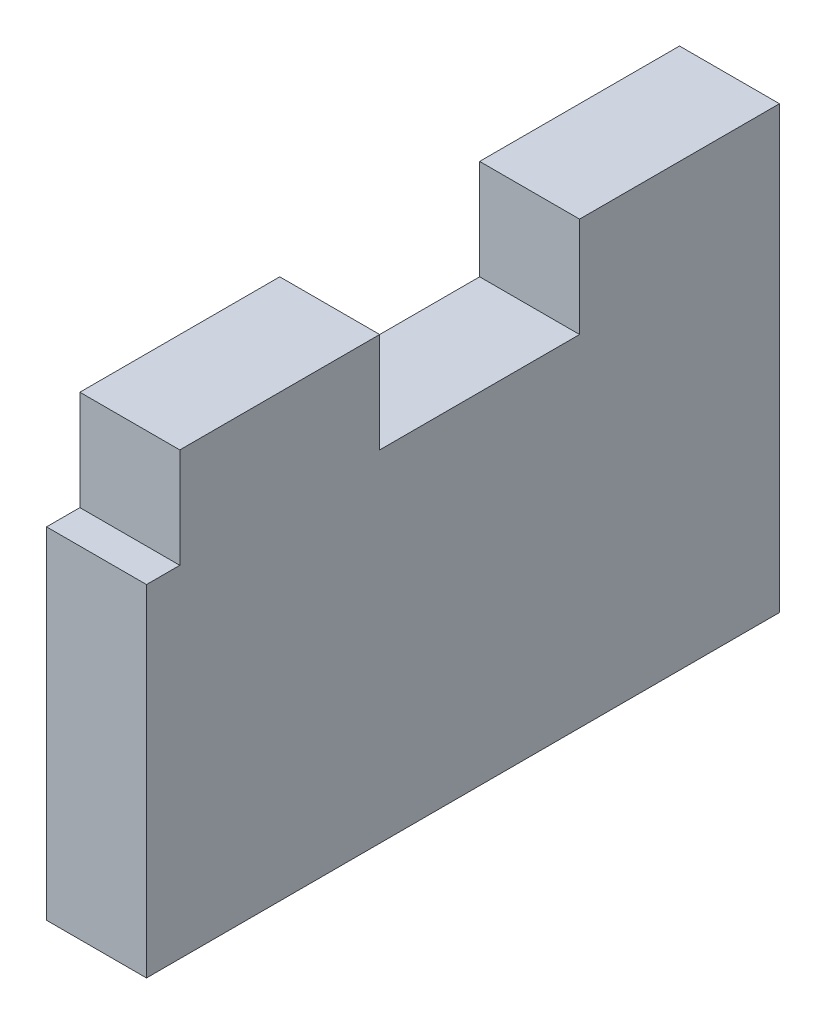
ISO-10303-21;
HEADER;
FILE_DESCRIPTION(('STEP AP214'),'2;1');
FILE_NAME('part.step','',(''),(''),'','','');
FILE_SCHEMA(('AUTOMOTIVE_DESIGN { 1 0 10303 214 1 1 1 1 }'));
ENDSEC;
DATA;
#1=APPLICATION_CONTEXT('core data for automotive mechanical design processes');
#2=APPLICATION_PROTOCOL_DEFINITION('international standard','automotive_design',2000,#1);
#3=PRODUCT_CONTEXT('',#1,'mechanical');
#4=PRODUCT('Part','Part','',(#3));
#5=PRODUCT_RELATED_PRODUCT_CATEGORY('part','',(#4));
#6=PRODUCT_DEFINITION_FORMATION('','',#4);
#7=PRODUCT_DEFINITION_CONTEXT('part definition',#1,'design');
#8=PRODUCT_DEFINITION('design','',#6,#7);
#9=PRODUCT_DEFINITION_SHAPE('','',#8);
#10=(LENGTH_UNIT() NAMED_UNIT(*) SI_UNIT(.MILLI.,.METRE.));
#11=(NAMED_UNIT(*) PLANE_ANGLE_UNIT() SI_UNIT($,.RADIAN.));
#12=(NAMED_UNIT(*) SI_UNIT($,.STERADIAN.) SOLID_ANGLE_UNIT());
#13=UNCERTAINTY_MEASURE_WITH_UNIT(LENGTH_MEASURE(1.E-05),#10,'distance_accuracy_value','');
#14=(GEOMETRIC_REPRESENTATION_CONTEXT(3) GLOBAL_UNCERTAINTY_ASSIGNED_CONTEXT((#13)) GLOBAL_UNIT_ASSIGNED_CONTEXT((#10,
#11,#12)) REPRESENTATION_CONTEXT('',''));
#15=CARTESIAN_POINT('',(0.,0.,0.));
#16=DIRECTION('',(0.,0.,1.));
#17=DIRECTION('',(1.,0.,0.));
#18=AXIS2_PLACEMENT_3D('',#15,#16,#17);
#19=CARTESIAN_POINT('',(9.525,0.,0.));
#20=DIRECTION('',(0.,0.,-1.));
#21=DIRECTION('',(0.,1.,0.));
#22=AXIS2_PLACEMENT_3D('',#19,#20,#21);
#23=PLANE('',#22);
#24=DIRECTION('',(0.,-1.,0.));
#25=VECTOR('',#24,1.);
#26=CARTESIAN_POINT('',(0.,0.,0.));
#27=LINE('',#26,#25);
#28=CARTESIAN_POINT('',(0.,32.474916,0.));
#29=VERTEX_POINT('',#28);
#30=CARTESIAN_POINT('',(0.,0.,0.));
#31=VERTEX_POINT('',#30);
#32=EDGE_CURVE('E152',#29,#31,#27,.T.);
#33=ORIENTED_EDGE('',*,*,#32,.T.);
#34=DIRECTION('',(-1.,0.,0.));
#35=VECTOR('',#34,1.);
#36=CARTESIAN_POINT('',(9.525,0.,0.));
#37=LINE('',#36,#35);
#38=CARTESIAN_POINT('',(9.525,0.,0.));
#39=VERTEX_POINT('',#38);
#40=EDGE_CURVE('E11',#39,#31,#37,.T.);
#41=ORIENTED_EDGE('',*,*,#40,.F.);
#42=DIRECTION('',(0.,-1.,0.));
#43=VECTOR('',#42,1.);
#44=CARTESIAN_POINT('',(9.525,0.,0.));
#45=LINE('',#44,#43);
#46=CARTESIAN_POINT('',(9.525,32.474916,0.));
#47=VERTEX_POINT('',#46);
#48=EDGE_CURVE('E180',#47,#39,#45,.T.);
#49=ORIENTED_EDGE('',*,*,#48,.F.);
#50=DIRECTION('',(-1.,0.,0.));
#51=VECTOR('',#50,1.);
#52=CARTESIAN_POINT('',(9.525,32.474916,0.));
#53=LINE('',#52,#51);
#54=EDGE_CURVE('E148',#47,#29,#53,.T.);
#55=ORIENTED_EDGE('',*,*,#54,.T.);
#56=EDGE_LOOP('',(#33,#41,#49,#55));
#57=FACE_BOUND('',#56,.T.);
#58=ADVANCED_FACE('F39',(#57),#23,.F.);
#59=CARTESIAN_POINT('',(9.525,0.,0.));
#60=DIRECTION('',(0.,1.,0.));
#61=DIRECTION('',(0.,0.,1.));
#62=AXIS2_PLACEMENT_3D('',#59,#60,#61);
#63=PLANE('',#62);
#64=DIRECTION('',(0.,0.,-1.));
#65=VECTOR('',#64,1.);
#66=CARTESIAN_POINT('',(0.,0.,0.));
#67=LINE('',#66,#65);
#68=CARTESIAN_POINT('',(0.,0.,-60.325));
#69=VERTEX_POINT('',#68);
#70=EDGE_CURVE('E156',#31,#69,#67,.T.);
#71=ORIENTED_EDGE('',*,*,#70,.T.);
#72=DIRECTION('',(-1.,0.,0.));
#73=VECTOR('',#72,1.);
#74=CARTESIAN_POINT('',(9.525,0.,-60.325));
#75=LINE('',#74,#73);
#76=CARTESIAN_POINT('',(9.525,0.,-60.325));
#77=VERTEX_POINT('',#76);
#78=EDGE_CURVE('E48',#77,#69,#75,.T.);
#79=ORIENTED_EDGE('',*,*,#78,.F.);
#80=DIRECTION('',(0.,0.,-1.));
#81=VECTOR('',#80,1.);
#82=CARTESIAN_POINT('',(9.525,0.,0.));
#83=LINE('',#82,#81);
#84=EDGE_CURVE('E105',#39,#77,#83,.T.);
#85=ORIENTED_EDGE('',*,*,#84,.F.);
#86=ORIENTED_EDGE('',*,*,#40,.T.);
#87=EDGE_LOOP('',(#71,#79,#85,#86));
#88=FACE_BOUND('',#87,.T.);
#89=ADVANCED_FACE('F244',(#88),#63,.F.);
#90=CARTESIAN_POINT('',(9.525,0.,-60.325));
#91=DIRECTION('',(0.,0.,1.));
#92=DIRECTION('',(0.,-1.,0.));
#93=AXIS2_PLACEMENT_3D('',#90,#91,#92);
#94=PLANE('',#93);
#95=DIRECTION('',(0.,1.,0.));
#96=VECTOR('',#95,1.);
#97=CARTESIAN_POINT('',(0.,0.,-60.325));
#98=LINE('',#97,#96);
#99=CARTESIAN_POINT('',(0.,41.999916,-60.325));
#100=VERTEX_POINT('',#99);
#101=EDGE_CURVE('E159',#69,#100,#98,.T.);
#102=ORIENTED_EDGE('',*,*,#101,.T.);
#103=DIRECTION('',(-1.,0.,0.));
#104=VECTOR('',#103,1.);
#105=CARTESIAN_POINT('',(9.525,41.999916,-60.325));
#106=LINE('',#105,#104);
#107=CARTESIAN_POINT('',(9.525,41.999916,-60.325));
#108=VERTEX_POINT('',#107);
#109=EDGE_CURVE('E199',#108,#100,#106,.T.);
#110=ORIENTED_EDGE('',*,*,#109,.F.);
#111=DIRECTION('',(0.,1.,0.));
#112=VECTOR('',#111,1.);
#113=CARTESIAN_POINT('',(9.525,0.,-60.325));
#114=LINE('',#113,#112);
#115=EDGE_CURVE('E209',#77,#108,#114,.T.);
#116=ORIENTED_EDGE('',*,*,#115,.F.);
#117=ORIENTED_EDGE('',*,*,#78,.T.);
#118=EDGE_LOOP('',(#102,#110,#116,#117));
#119=FACE_BOUND('',#118,.T.);
#120=ADVANCED_FACE('F207',(#119),#94,.F.);
#121=CARTESIAN_POINT('',(9.525,41.999916,-41.275));
#122=DIRECTION('',(0.,-1.,0.));
#123=DIRECTION('',(0.,0.,-1.));
#124=AXIS2_PLACEMENT_3D('',#121,#122,#123);
#125=PLANE('',#124);
#126=DIRECTION('',(0.,0.,1.));
#127=VECTOR('',#126,1.);
#128=CARTESIAN_POINT('',(0.,41.999916,-41.275));
#129=LINE('',#128,#127);
#130=CARTESIAN_POINT('',(0.,41.999916,-41.275));
#131=VERTEX_POINT('',#130);
#132=EDGE_CURVE('E162',#100,#131,#129,.T.);
#133=ORIENTED_EDGE('',*,*,#132,.T.);
#134=DIRECTION('',(-1.,0.,0.));
#135=VECTOR('',#134,1.);
#136=CARTESIAN_POINT('',(9.525,41.999916,-41.275));
#137=LINE('',#136,#135);
#138=CARTESIAN_POINT('',(9.525,41.999916,-41.275));
#139=VERTEX_POINT('',#138);
#140=EDGE_CURVE('E195',#139,#131,#137,.T.);
#141=ORIENTED_EDGE('',*,*,#140,.F.);
#142=DIRECTION('',(0.,0.,1.));
#143=VECTOR('',#142,1.);
#144=CARTESIAN_POINT('',(9.525,41.999916,-41.275));
#145=LINE('',#144,#143);
#146=EDGE_CURVE('E228',#108,#139,#145,.T.);
#147=ORIENTED_EDGE('',*,*,#146,.F.);
#148=ORIENTED_EDGE('',*,*,#109,.T.);
#149=EDGE_LOOP('',(#133,#141,#147,#148));
#150=FACE_BOUND('',#149,.T.);
#151=ADVANCED_FACE('F218',(#150),#125,.F.);
#152=CARTESIAN_POINT('',(9.525,32.474916,-41.275));
#153=DIRECTION('',(0.,0.,-1.));
#154=DIRECTION('',(0.,1.,0.));
#155=AXIS2_PLACEMENT_3D('',#152,#153,#154);
#156=PLANE('',#155);
#157=DIRECTION('',(0.,-1.,0.));
#158=VECTOR('',#157,1.);
#159=CARTESIAN_POINT('',(0.,32.474916,-41.275));
#160=LINE('',#159,#158);
#161=CARTESIAN_POINT('',(0.,32.474916,-41.275));
#162=VERTEX_POINT('',#161);
#163=EDGE_CURVE('E165',#131,#162,#160,.T.);
#164=ORIENTED_EDGE('',*,*,#163,.T.);
#165=DIRECTION('',(-1.,0.,0.));
#166=VECTOR('',#165,1.);
#167=CARTESIAN_POINT('',(9.525,32.474916,-41.275));
#168=LINE('',#167,#166);
#169=CARTESIAN_POINT('',(9.525,32.474916,-41.275));
#170=VERTEX_POINT('',#169);
#171=EDGE_CURVE('E191',#170,#162,#168,.T.);
#172=ORIENTED_EDGE('',*,*,#171,.F.);
#173=DIRECTION('',(0.,-1.,0.));
#174=VECTOR('',#173,1.);
#175=CARTESIAN_POINT('',(9.525,32.474916,-41.275));
#176=LINE('',#175,#174);
#177=EDGE_CURVE('E224',#139,#170,#176,.T.);
#178=ORIENTED_EDGE('',*,*,#177,.F.);
#179=ORIENTED_EDGE('',*,*,#140,.T.);
#180=EDGE_LOOP('',(#164,#172,#178,#179));
#181=FACE_BOUND('',#180,.T.);
#182=ADVANCED_FACE('F222',(#181),#156,.F.);
#183=CARTESIAN_POINT('',(9.525,32.474916,-22.225));
#184=DIRECTION('',(0.,-1.,0.));
#185=DIRECTION('',(0.,0.,-1.));
#186=AXIS2_PLACEMENT_3D('',#183,#184,#185);
#187=PLANE('',#186);
#188=DIRECTION('',(0.,0.,1.));
#189=VECTOR('',#188,1.);
#190=CARTESIAN_POINT('',(0.,32.474916,-22.225));
#191=LINE('',#190,#189);
#192=CARTESIAN_POINT('',(0.,32.474916,-22.225));
#193=VERTEX_POINT('',#192);
#194=EDGE_CURVE('E168',#162,#193,#191,.T.);
#195=ORIENTED_EDGE('',*,*,#194,.T.);
#196=DIRECTION('',(-1.,0.,0.));
#197=VECTOR('',#196,1.);
#198=CARTESIAN_POINT('',(9.525,32.474916,-22.225));
#199=LINE('',#198,#197);
#200=CARTESIAN_POINT('',(9.525,32.474916,-22.225));
#201=VERTEX_POINT('',#200);
#202=EDGE_CURVE('E187',#201,#193,#199,.T.);
#203=ORIENTED_EDGE('',*,*,#202,.F.);
#204=DIRECTION('',(0.,0.,1.));
#205=VECTOR('',#204,1.);
#206=CARTESIAN_POINT('',(9.525,32.474916,-22.225));
#207=LINE('',#206,#205);
#208=EDGE_CURVE('E227',#170,#201,#207,.T.);
#209=ORIENTED_EDGE('',*,*,#208,.F.);
#210=ORIENTED_EDGE('',*,*,#171,.T.);
#211=EDGE_LOOP('',(#195,#203,#209,#210));
#212=FACE_BOUND('',#211,.T.);
#213=ADVANCED_FACE('F256',(#212),#187,.F.);
#214=CARTESIAN_POINT('',(9.525,32.474916,-22.225));
#215=DIRECTION('',(0.,0.,1.));
#216=DIRECTION('',(0.,-1.,0.));
#217=AXIS2_PLACEMENT_3D('',#214,#215,#216);
#218=PLANE('',#217);
#219=DIRECTION('',(0.,1.,0.));
#220=VECTOR('',#219,1.);
#221=CARTESIAN_POINT('',(0.,32.474916,-22.225));
#222=LINE('',#221,#220);
#223=CARTESIAN_POINT('',(0.,41.999916,-22.225));
#224=VERTEX_POINT('',#223);
#225=EDGE_CURVE('E171',#193,#224,#222,.T.);
#226=ORIENTED_EDGE('',*,*,#225,.T.);
#227=DIRECTION('',(-1.,0.,0.));
#228=VECTOR('',#227,1.);
#229=CARTESIAN_POINT('',(9.525,41.999916,-22.225));
#230=LINE('',#229,#228);
#231=CARTESIAN_POINT('',(9.525,41.999916,-22.225));
#232=VERTEX_POINT('',#231);
#233=EDGE_CURVE('E141',#232,#224,#230,.T.);
#234=ORIENTED_EDGE('',*,*,#233,.F.);
#235=DIRECTION('',(0.,1.,0.));
#236=VECTOR('',#235,1.);
#237=CARTESIAN_POINT('',(9.525,32.474916,-22.225));
#238=LINE('',#237,#236);
#239=EDGE_CURVE('E130',#201,#232,#238,.T.);
#240=ORIENTED_EDGE('',*,*,#239,.F.);
#241=ORIENTED_EDGE('',*,*,#202,.T.);
#242=EDGE_LOOP('',(#226,#234,#240,#241));
#243=FACE_BOUND('',#242,.T.);
#244=ADVANCED_FACE('F259',(#243),#218,.F.);
#245=CARTESIAN_POINT('',(9.525,41.999916,-3.17499999999999));
#246=DIRECTION('',(0.,-1.,0.));
#247=DIRECTION('',(0.,0.,-1.));
#248=AXIS2_PLACEMENT_3D('',#245,#246,#247);
#249=PLANE('',#248);
#250=DIRECTION('',(0.,0.,1.));
#251=VECTOR('',#250,1.);
#252=CARTESIAN_POINT('',(0.,41.999916,-3.17499999999999));
#253=LINE('',#252,#251);
#254=CARTESIAN_POINT('',(0.,41.999916,-3.17499999999999));
#255=VERTEX_POINT('',#254);
#256=EDGE_CURVE('E139',#224,#255,#253,.T.);
#257=ORIENTED_EDGE('',*,*,#256,.T.);
#258=DIRECTION('',(-1.,0.,0.));
#259=VECTOR('',#258,1.);
#260=CARTESIAN_POINT('',(9.525,41.999916,-3.17499999999999));
#261=LINE('',#260,#259);
#262=CARTESIAN_POINT('',(9.525,41.999916,-3.17499999999999));
#263=VERTEX_POINT('',#262);
#264=EDGE_CURVE('E136',#263,#255,#261,.T.);
#265=ORIENTED_EDGE('',*,*,#264,.F.);
#266=DIRECTION('',(0.,0.,1.));
#267=VECTOR('',#266,1.);
#268=CARTESIAN_POINT('',(9.525,41.999916,-3.17499999999999));
#269=LINE('',#268,#267);
#270=EDGE_CURVE('E124',#232,#263,#269,.T.);
#271=ORIENTED_EDGE('',*,*,#270,.F.);
#272=ORIENTED_EDGE('',*,*,#233,.T.);
#273=EDGE_LOOP('',(#257,#265,#271,#272));
#274=FACE_BOUND('',#273,.T.);
#275=ADVANCED_FACE('F137',(#274),#249,.F.);
#276=CARTESIAN_POINT('',(9.525,41.999916,-3.17499999999999));
#277=DIRECTION('',(0.,0.,-1.));
#278=DIRECTION('',(0.,1.,0.));
#279=AXIS2_PLACEMENT_3D('',#276,#277,#278);
#280=PLANE('',#279);
#281=DIRECTION('',(0.,-1.,0.));
#282=VECTOR('',#281,1.);
#283=CARTESIAN_POINT('',(0.,41.999916,-3.17499999999999));
#284=LINE('',#283,#282);
#285=CARTESIAN_POINT('',(0.,32.474916,-3.17499999999999));
#286=VERTEX_POINT('',#285);
#287=EDGE_CURVE('E91',#255,#286,#284,.T.);
#288=ORIENTED_EDGE('',*,*,#287,.T.);
#289=DIRECTION('',(-1.,0.,0.));
#290=VECTOR('',#289,1.);
#291=CARTESIAN_POINT('',(9.525,32.474916,-3.17499999999999));
#292=LINE('',#291,#290);
#293=CARTESIAN_POINT('',(9.525,32.474916,-3.17499999999999));
#294=VERTEX_POINT('',#293);
#295=EDGE_CURVE('E142',#294,#286,#292,.T.);
#296=ORIENTED_EDGE('',*,*,#295,.F.);
#297=DIRECTION('',(0.,-1.,0.));
#298=VECTOR('',#297,1.);
#299=CARTESIAN_POINT('',(9.525,41.999916,-3.17499999999999));
#300=LINE('',#299,#298);
#301=EDGE_CURVE('E128',#263,#294,#300,.T.);
#302=ORIENTED_EDGE('',*,*,#301,.F.);
#303=ORIENTED_EDGE('',*,*,#264,.T.);
#304=EDGE_LOOP('',(#288,#296,#302,#303));
#305=FACE_BOUND('',#304,.T.);
#306=ADVANCED_FACE('F144',(#305),#280,.F.);
#307=CARTESIAN_POINT('',(9.525,32.474916,0.));
#308=DIRECTION('',(0.,-1.,0.));
#309=DIRECTION('',(0.,0.,-1.));
#310=AXIS2_PLACEMENT_3D('',#307,#308,#309);
#311=PLANE('',#310);
#312=DIRECTION('',(0.,0.,1.));
#313=VECTOR('',#312,1.);
#314=CARTESIAN_POINT('',(0.,32.474916,0.));
#315=LINE('',#314,#313);
#316=EDGE_CURVE('E97',#286,#29,#315,.T.);
#317=ORIENTED_EDGE('',*,*,#316,.T.);
#318=ORIENTED_EDGE('',*,*,#54,.F.);
#319=DIRECTION('',(0.,0.,1.));
#320=VECTOR('',#319,1.);
#321=CARTESIAN_POINT('',(9.525,32.474916,0.));
#322=LINE('',#321,#320);
#323=EDGE_CURVE('E56',#294,#47,#322,.T.);
#324=ORIENTED_EDGE('',*,*,#323,.F.);
#325=ORIENTED_EDGE('',*,*,#295,.T.);
#326=EDGE_LOOP('',(#317,#318,#324,#325));
#327=FACE_BOUND('',#326,.T.);
#328=ADVANCED_FACE('F268',(#327),#311,.F.);
#329=CARTESIAN_POINT('',(9.525,0.,0.));
#330=DIRECTION('',(-1.,0.,0.));
#331=DIRECTION('',(0.,0.,1.));
#332=AXIS2_PLACEMENT_3D('',#329,#330,#331);
#333=PLANE('',#332);
#334=ORIENTED_EDGE('',*,*,#48,.T.);
#335=ORIENTED_EDGE('',*,*,#84,.T.);
#336=ORIENTED_EDGE('',*,*,#115,.T.);
#337=ORIENTED_EDGE('',*,*,#146,.T.);
#338=ORIENTED_EDGE('',*,*,#177,.T.);
#339=ORIENTED_EDGE('',*,*,#208,.T.);
#340=ORIENTED_EDGE('',*,*,#239,.T.);
#341=ORIENTED_EDGE('',*,*,#270,.T.);
#342=ORIENTED_EDGE('',*,*,#301,.T.);
#343=ORIENTED_EDGE('',*,*,#323,.T.);
#344=EDGE_LOOP('',(#334,#335,#336,#337,#338,#339,#340,#341,#342,#343));
#345=FACE_BOUND('',#344,.T.);
#346=ADVANCED_FACE('F126',(#345),#333,.F.);
#347=CARTESIAN_POINT('',(0.,0.,0.));
#348=DIRECTION('',(-1.,0.,0.));
#349=DIRECTION('',(0.,0.,1.));
#350=AXIS2_PLACEMENT_3D('',#347,#348,#349);
#351=PLANE('',#350);
#352=ORIENTED_EDGE('',*,*,#32,.F.);
#353=ORIENTED_EDGE('',*,*,#316,.F.);
#354=ORIENTED_EDGE('',*,*,#287,.F.);
#355=ORIENTED_EDGE('',*,*,#256,.F.);
#356=ORIENTED_EDGE('',*,*,#225,.F.);
#357=ORIENTED_EDGE('',*,*,#194,.F.);
#358=ORIENTED_EDGE('',*,*,#163,.F.);
#359=ORIENTED_EDGE('',*,*,#132,.F.);
#360=ORIENTED_EDGE('',*,*,#101,.F.);
#361=ORIENTED_EDGE('',*,*,#70,.F.);
#362=EDGE_LOOP('',(#352,#353,#354,#355,#356,#357,#358,#359,#360,#361));
#363=FACE_BOUND('',#362,.T.);
#364=ADVANCED_FACE('F213',(#363),#351,.T.);
#365=CLOSED_SHELL('',(#58,#89,#120,#151,#182,#213,#244,#275,#306,#328,#346,#364));
#366=MANIFOLD_SOLID_BREP('B2',#365);
#367=ADVANCED_BREP_SHAPE_REPRESENTATION('',(#18,#366),#14);
#368=SHAPE_DEFINITION_REPRESENTATION(#9,#367);
ENDSEC;
END-ISO-10303-21;
